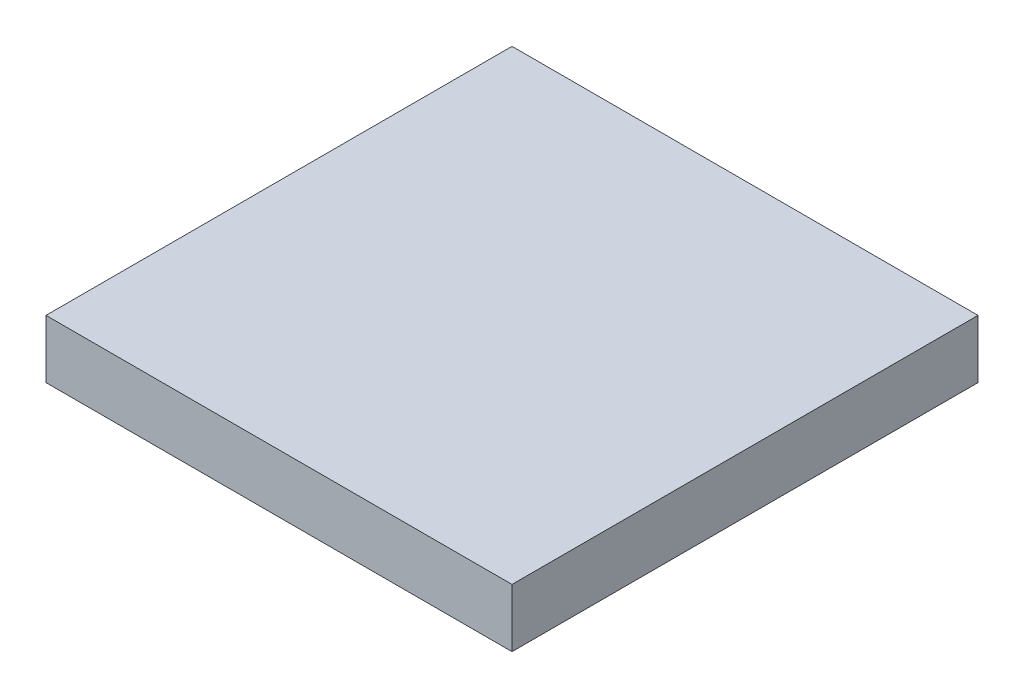
ISO-10303-21;
HEADER;
FILE_DESCRIPTION(('STEP AP214'),'2;1');
FILE_NAME('part.step','',(''),(''),'','','');
FILE_SCHEMA(('AUTOMOTIVE_DESIGN { 1 0 10303 214 1 1 1 1 }'));
ENDSEC;
DATA;
#1=APPLICATION_CONTEXT('core data for automotive mechanical design processes');
#2=APPLICATION_PROTOCOL_DEFINITION('international standard','automotive_design',2000,#1);
#3=PRODUCT_CONTEXT('',#1,'mechanical');
#4=PRODUCT('Part','Part','',(#3));
#5=PRODUCT_RELATED_PRODUCT_CATEGORY('part','',(#4));
#6=PRODUCT_DEFINITION_FORMATION('','',#4);
#7=PRODUCT_DEFINITION_CONTEXT('part definition',#1,'design');
#8=PRODUCT_DEFINITION('design','',#6,#7);
#9=PRODUCT_DEFINITION_SHAPE('','',#8);
#10=(LENGTH_UNIT() NAMED_UNIT(*) SI_UNIT(.MILLI.,.METRE.));
#11=(NAMED_UNIT(*) PLANE_ANGLE_UNIT() SI_UNIT($,.RADIAN.));
#12=(NAMED_UNIT(*) SI_UNIT($,.STERADIAN.) SOLID_ANGLE_UNIT());
#13=UNCERTAINTY_MEASURE_WITH_UNIT(LENGTH_MEASURE(1.E-05),#10,'distance_accuracy_value','');
#14=(GEOMETRIC_REPRESENTATION_CONTEXT(3) GLOBAL_UNCERTAINTY_ASSIGNED_CONTEXT((#13)) GLOBAL_UNIT_ASSIGNED_CONTEXT((#10,
#11,#12)) REPRESENTATION_CONTEXT('',''));
#15=CARTESIAN_POINT('',(0.,0.,0.));
#16=DIRECTION('',(0.,0.,1.));
#17=DIRECTION('',(1.,0.,0.));
#18=AXIS2_PLACEMENT_3D('',#15,#16,#17);
#19=CARTESIAN_POINT('',(0.,2.5,-20.));
#20=DIRECTION('',(1.,0.,0.));
#21=DIRECTION('',(0.,0.,-1.));
#22=AXIS2_PLACEMENT_3D('',#19,#20,#21);
#23=PLANE('',#22);
#24=DIRECTION('',(0.,0.,1.));
#25=VECTOR('',#24,1.);
#26=CARTESIAN_POINT('',(0.,0.,-20.));
#27=LINE('',#26,#25);
#28=CARTESIAN_POINT('',(0.,0.,-20.));
#29=VERTEX_POINT('',#28);
#30=CARTESIAN_POINT('',(0.,0.,0.));
#31=VERTEX_POINT('',#30);
#32=EDGE_CURVE('E111',#29,#31,#27,.T.);
#33=ORIENTED_EDGE('',*,*,#32,.T.);
#34=DIRECTION('',(0.,-1.,0.));
#35=VECTOR('',#34,1.);
#36=CARTESIAN_POINT('',(0.,2.5,0.));
#37=LINE('',#36,#35);
#38=CARTESIAN_POINT('',(0.,2.5,0.));
#39=VERTEX_POINT('',#38);
#40=EDGE_CURVE('E11',#39,#31,#37,.T.);
#41=ORIENTED_EDGE('',*,*,#40,.F.);
#42=DIRECTION('',(0.,0.,1.));
#43=VECTOR('',#42,1.);
#44=CARTESIAN_POINT('',(0.,2.5,-20.));
#45=LINE('',#44,#43);
#46=CARTESIAN_POINT('',(0.,2.5,-20.));
#47=VERTEX_POINT('',#46);
#48=EDGE_CURVE('E95',#47,#39,#45,.T.);
#49=ORIENTED_EDGE('',*,*,#48,.F.);
#50=DIRECTION('',(0.,-1.,0.));
#51=VECTOR('',#50,1.);
#52=CARTESIAN_POINT('',(0.,2.5,-20.));
#53=LINE('',#52,#51);
#54=EDGE_CURVE('E107',#47,#29,#53,.T.);
#55=ORIENTED_EDGE('',*,*,#54,.T.);
#56=EDGE_LOOP('',(#33,#41,#49,#55));
#57=FACE_BOUND('',#56,.T.);
#58=ADVANCED_FACE('F43',(#57),#23,.F.);
#59=CARTESIAN_POINT('',(0.,2.5,0.));
#60=DIRECTION('',(0.,0.,-1.));
#61=DIRECTION('',(-1.,0.,0.));
#62=AXIS2_PLACEMENT_3D('',#59,#60,#61);
#63=PLANE('',#62);
#64=DIRECTION('',(1.,0.,0.));
#65=VECTOR('',#64,1.);
#66=CARTESIAN_POINT('',(0.,0.,0.));
#67=LINE('',#66,#65);
#68=CARTESIAN_POINT('',(20.,0.,0.));
#69=VERTEX_POINT('',#68);
#70=EDGE_CURVE('E100',#31,#69,#67,.T.);
#71=ORIENTED_EDGE('',*,*,#70,.T.);
#72=DIRECTION('',(0.,-1.,0.));
#73=VECTOR('',#72,1.);
#74=CARTESIAN_POINT('',(20.,2.5,0.));
#75=LINE('',#74,#73);
#76=CARTESIAN_POINT('',(20.,2.5,0.));
#77=VERTEX_POINT('',#76);
#78=EDGE_CURVE('E52',#77,#69,#75,.T.);
#79=ORIENTED_EDGE('',*,*,#78,.F.);
#80=DIRECTION('',(1.,0.,0.));
#81=VECTOR('',#80,1.);
#82=CARTESIAN_POINT('',(0.,2.5,0.));
#83=LINE('',#82,#81);
#84=EDGE_CURVE('E90',#39,#77,#83,.T.);
#85=ORIENTED_EDGE('',*,*,#84,.F.);
#86=ORIENTED_EDGE('',*,*,#40,.T.);
#87=EDGE_LOOP('',(#71,#79,#85,#86));
#88=FACE_BOUND('',#87,.T.);
#89=ADVANCED_FACE('F99',(#88),#63,.F.);
#90=CARTESIAN_POINT('',(20.,2.5,0.));
#91=DIRECTION('',(-1.,0.,0.));
#92=DIRECTION('',(0.,0.,1.));
#93=AXIS2_PLACEMENT_3D('',#90,#91,#92);
#94=PLANE('',#93);
#95=DIRECTION('',(0.,0.,-1.));
#96=VECTOR('',#95,1.);
#97=CARTESIAN_POINT('',(20.,0.,0.));
#98=LINE('',#97,#96);
#99=CARTESIAN_POINT('',(20.,0.,-20.));
#100=VERTEX_POINT('',#99);
#101=EDGE_CURVE('E77',#69,#100,#98,.T.);
#102=ORIENTED_EDGE('',*,*,#101,.T.);
#103=DIRECTION('',(0.,-1.,0.));
#104=VECTOR('',#103,1.);
#105=CARTESIAN_POINT('',(20.,2.5,-20.));
#106=LINE('',#105,#104);
#107=CARTESIAN_POINT('',(20.,2.5,-20.));
#108=VERTEX_POINT('',#107);
#109=EDGE_CURVE('E102',#108,#100,#106,.T.);
#110=ORIENTED_EDGE('',*,*,#109,.F.);
#111=DIRECTION('',(0.,0.,-1.));
#112=VECTOR('',#111,1.);
#113=CARTESIAN_POINT('',(20.,2.5,0.));
#114=LINE('',#113,#112);
#115=EDGE_CURVE('E93',#77,#108,#114,.T.);
#116=ORIENTED_EDGE('',*,*,#115,.F.);
#117=ORIENTED_EDGE('',*,*,#78,.T.);
#118=EDGE_LOOP('',(#102,#110,#116,#117));
#119=FACE_BOUND('',#118,.T.);
#120=ADVANCED_FACE('F103',(#119),#94,.F.);
#121=CARTESIAN_POINT('',(20.,2.5,-20.));
#122=DIRECTION('',(0.,0.,1.));
#123=DIRECTION('',(1.,0.,0.));
#124=AXIS2_PLACEMENT_3D('',#121,#122,#123);
#125=PLANE('',#124);
#126=DIRECTION('',(-1.,0.,0.));
#127=VECTOR('',#126,1.);
#128=CARTESIAN_POINT('',(20.,0.,-20.));
#129=LINE('',#128,#127);
#130=EDGE_CURVE('E83',#100,#29,#129,.T.);
#131=ORIENTED_EDGE('',*,*,#130,.T.);
#132=ORIENTED_EDGE('',*,*,#54,.F.);
#133=DIRECTION('',(-1.,0.,0.));
#134=VECTOR('',#133,1.);
#135=CARTESIAN_POINT('',(20.,2.5,-20.));
#136=LINE('',#135,#134);
#137=EDGE_CURVE('E60',#108,#47,#136,.T.);
#138=ORIENTED_EDGE('',*,*,#137,.F.);
#139=ORIENTED_EDGE('',*,*,#109,.T.);
#140=EDGE_LOOP('',(#131,#132,#138,#139));
#141=FACE_BOUND('',#140,.T.);
#142=ADVANCED_FACE('F124',(#141),#125,.F.);
#143=CARTESIAN_POINT('',(0.,2.5,0.));
#144=DIRECTION('',(0.,1.,0.));
#145=DIRECTION('',(0.,0.,1.));
#146=AXIS2_PLACEMENT_3D('',#143,#144,#145);
#147=PLANE('',#146);
#148=ORIENTED_EDGE('',*,*,#48,.T.);
#149=ORIENTED_EDGE('',*,*,#84,.T.);
#150=ORIENTED_EDGE('',*,*,#115,.T.);
#151=ORIENTED_EDGE('',*,*,#137,.T.);
#152=EDGE_LOOP('',(#148,#149,#150,#151));
#153=FACE_BOUND('',#152,.T.);
#154=ADVANCED_FACE('F91',(#153),#147,.T.);
#155=CARTESIAN_POINT('',(0.,0.,0.));
#156=DIRECTION('',(0.,1.,0.));
#157=DIRECTION('',(0.,0.,1.));
#158=AXIS2_PLACEMENT_3D('',#155,#156,#157);
#159=PLANE('',#158);
#160=ORIENTED_EDGE('',*,*,#32,.F.);
#161=ORIENTED_EDGE('',*,*,#130,.F.);
#162=ORIENTED_EDGE('',*,*,#101,.F.);
#163=ORIENTED_EDGE('',*,*,#70,.F.);
#164=EDGE_LOOP('',(#160,#161,#162,#163));
#165=FACE_BOUND('',#164,.T.);
#166=ADVANCED_FACE('F127',(#165),#159,.F.);
#167=CLOSED_SHELL('',(#58,#89,#120,#142,#154,#166));
#168=MANIFOLD_SOLID_BREP('B2',#167);
#169=ADVANCED_BREP_SHAPE_REPRESENTATION('',(#18,#168),#14);
#170=SHAPE_DEFINITION_REPRESENTATION(#9,#169);
ENDSEC;
END-ISO-10303-21;
